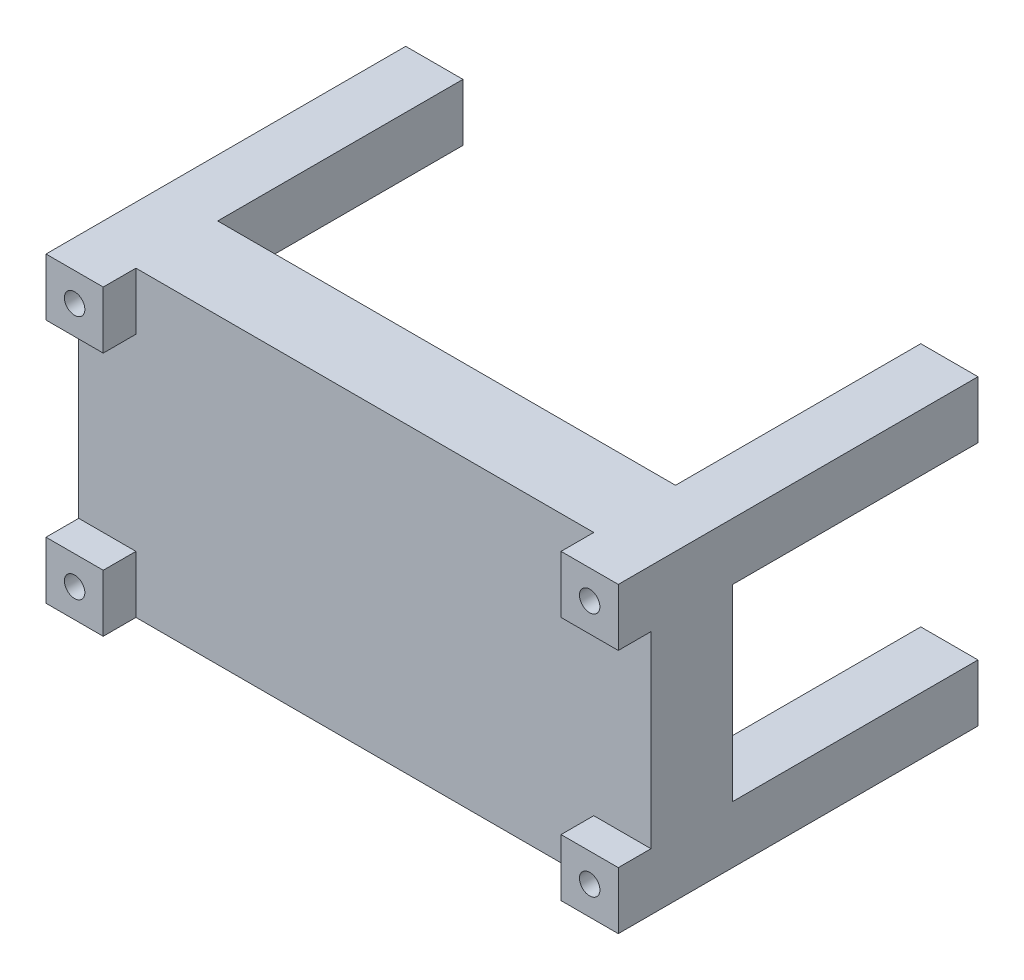
ISO-10303-21;
HEADER;
FILE_DESCRIPTION(('STEP AP214'),'2;1');
FILE_NAME('part.step','',(''),(''),'','','');
FILE_SCHEMA(('AUTOMOTIVE_DESIGN { 1 0 10303 214 1 1 1 1 }'));
ENDSEC;
DATA;
#1=APPLICATION_CONTEXT('core data for automotive mechanical design processes');
#2=APPLICATION_PROTOCOL_DEFINITION('international standard','automotive_design',2000,#1);
#3=PRODUCT_CONTEXT('',#1,'mechanical');
#4=PRODUCT('Part','Part','',(#3));
#5=PRODUCT_RELATED_PRODUCT_CATEGORY('part','',(#4));
#6=PRODUCT_DEFINITION_FORMATION('','',#4);
#7=PRODUCT_DEFINITION_CONTEXT('part definition',#1,'design');
#8=PRODUCT_DEFINITION('design','',#6,#7);
#9=PRODUCT_DEFINITION_SHAPE('','',#8);
#10=(LENGTH_UNIT() NAMED_UNIT(*) SI_UNIT(.MILLI.,.METRE.));
#11=(NAMED_UNIT(*) PLANE_ANGLE_UNIT() SI_UNIT($,.RADIAN.));
#12=(NAMED_UNIT(*) SI_UNIT($,.STERADIAN.) SOLID_ANGLE_UNIT());
#13=UNCERTAINTY_MEASURE_WITH_UNIT(LENGTH_MEASURE(1.E-05),#10,'distance_accuracy_value','');
#14=(GEOMETRIC_REPRESENTATION_CONTEXT(3) GLOBAL_UNCERTAINTY_ASSIGNED_CONTEXT((#13)) GLOBAL_UNIT_ASSIGNED_CONTEXT((#10,
#11,#12)) REPRESENTATION_CONTEXT('',''));
#15=CARTESIAN_POINT('',(0.,0.,0.));
#16=DIRECTION('',(0.,0.,1.));
#17=DIRECTION('',(1.,0.,0.));
#18=AXIS2_PLACEMENT_3D('',#15,#16,#17);
#19=CARTESIAN_POINT('',(0.,0.,10.));
#20=DIRECTION('',(1.,0.,0.));
#21=DIRECTION('',(0.,0.,-1.));
#22=AXIS2_PLACEMENT_3D('',#19,#20,#21);
#23=PLANE('',#22);
#24=DIRECTION('',(0.,-1.,0.));
#25=VECTOR('',#24,1.);
#26=CARTESIAN_POINT('',(0.,0.,0.));
#27=LINE('',#26,#25);
#28=CARTESIAN_POINT('',(0.,30.,0.));
#29=VERTEX_POINT('',#28);
#30=CARTESIAN_POINT('',(0.,7.,0.));
#31=VERTEX_POINT('',#30);
#32=EDGE_CURVE('E438',#29,#31,#27,.T.);
#33=ORIENTED_EDGE('',*,*,#32,.T.);
#34=DIRECTION('',(0.,0.,1.));
#35=VECTOR('',#34,1.);
#36=CARTESIAN_POINT('',(0.,7.,-30.));
#37=LINE('',#36,#35);
#38=CARTESIAN_POINT('',(0.,7.,-30.));
#39=VERTEX_POINT('',#38);
#40=EDGE_CURVE('E266',#39,#31,#37,.T.);
#41=ORIENTED_EDGE('',*,*,#40,.F.);
#42=DIRECTION('',(0.,-1.,0.));
#43=VECTOR('',#42,1.);
#44=CARTESIAN_POINT('',(0.,0.,-30.));
#45=LINE('',#44,#43);
#46=CARTESIAN_POINT('',(0.,0.,-30.));
#47=VERTEX_POINT('',#46);
#48=EDGE_CURVE('E225',#39,#47,#45,.T.);
#49=ORIENTED_EDGE('',*,*,#48,.T.);
#50=DIRECTION('',(0.,0.,-1.));
#51=VECTOR('',#50,1.);
#52=CARTESIAN_POINT('',(0.,0.,10.));
#53=LINE('',#52,#51);
#54=CARTESIAN_POINT('',(0.,0.,14.));
#55=VERTEX_POINT('',#54);
#56=EDGE_CURVE('E218',#55,#47,#53,.T.);
#57=ORIENTED_EDGE('',*,*,#56,.F.);
#58=DIRECTION('',(0.,-1.,0.));
#59=VECTOR('',#58,1.);
#60=CARTESIAN_POINT('',(0.,0.,14.));
#61=LINE('',#60,#59);
#62=CARTESIAN_POINT('',(0.,7.,14.));
#63=VERTEX_POINT('',#62);
#64=EDGE_CURVE('E223',#63,#55,#61,.T.);
#65=ORIENTED_EDGE('',*,*,#64,.F.);
#66=CARTESIAN_POINT('',(0.,7.,10.));
#67=VERTEX_POINT('',#66);
#68=EDGE_CURVE('E269',#67,#63,#37,.T.);
#69=ORIENTED_EDGE('',*,*,#68,.F.);
#70=DIRECTION('',(0.,-1.,0.));
#71=VECTOR('',#70,1.);
#72=CARTESIAN_POINT('',(0.,0.,10.));
#73=LINE('',#72,#71);
#74=CARTESIAN_POINT('',(0.,30.,10.));
#75=VERTEX_POINT('',#74);
#76=EDGE_CURVE('E53',#75,#67,#73,.T.);
#77=ORIENTED_EDGE('',*,*,#76,.F.);
#78=DIRECTION('',(0.,0.,1.));
#79=VECTOR('',#78,1.);
#80=CARTESIAN_POINT('',(0.,30.,-30.));
#81=LINE('',#80,#79);
#82=CARTESIAN_POINT('',(0.,30.,14.));
#83=VERTEX_POINT('',#82);
#84=EDGE_CURVE('E415',#75,#83,#81,.T.);
#85=ORIENTED_EDGE('',*,*,#84,.T.);
#86=DIRECTION('',(0.,-1.,0.));
#87=VECTOR('',#86,1.);
#88=CARTESIAN_POINT('',(0.,37.,14.));
#89=LINE('',#88,#87);
#90=CARTESIAN_POINT('',(0.,37.,14.));
#91=VERTEX_POINT('',#90);
#92=EDGE_CURVE('E388',#91,#83,#89,.T.);
#93=ORIENTED_EDGE('',*,*,#92,.F.);
#94=DIRECTION('',(0.,0.,-1.));
#95=VECTOR('',#94,1.);
#96=CARTESIAN_POINT('',(0.,37.,10.));
#97=LINE('',#96,#95);
#98=CARTESIAN_POINT('',(0.,37.,-30.));
#99=VERTEX_POINT('',#98);
#100=EDGE_CURVE('E447',#91,#99,#97,.T.);
#101=ORIENTED_EDGE('',*,*,#100,.T.);
#102=DIRECTION('',(0.,-1.,0.));
#103=VECTOR('',#102,1.);
#104=CARTESIAN_POINT('',(0.,37.,-30.));
#105=LINE('',#104,#103);
#106=CARTESIAN_POINT('',(0.,30.,-30.));
#107=VERTEX_POINT('',#106);
#108=EDGE_CURVE('E403',#99,#107,#105,.T.);
#109=ORIENTED_EDGE('',*,*,#108,.T.);
#110=EDGE_CURVE('E425',#107,#29,#81,.T.);
#111=ORIENTED_EDGE('',*,*,#110,.T.);
#112=EDGE_LOOP('',(#33,#41,#49,#57,#65,#69,#77,#85,#93,#101,#109,#111));
#113=FACE_BOUND('',#112,.T.);
#114=ADVANCED_FACE('F33',(#113),#23,.F.);
#115=CARTESIAN_POINT('',(0.,0.,10.));
#116=DIRECTION('',(0.,1.,0.));
#117=DIRECTION('',(0.,0.,1.));
#118=AXIS2_PLACEMENT_3D('',#115,#116,#117);
#119=PLANE('',#118);
#120=DIRECTION('',(1.,0.,0.));
#121=VECTOR('',#120,1.);
#122=CARTESIAN_POINT('',(0.,0.,10.));
#123=LINE('',#122,#121);
#124=CARTESIAN_POINT('',(7.,0.,10.));
#125=VERTEX_POINT('',#124);
#126=CARTESIAN_POINT('',(63.,0.,10.));
#127=VERTEX_POINT('',#126);
#128=EDGE_CURVE('E440',#125,#127,#123,.T.);
#129=ORIENTED_EDGE('',*,*,#128,.F.);
#130=DIRECTION('',(0.,0.,1.));
#131=VECTOR('',#130,1.);
#132=CARTESIAN_POINT('',(7.,0.,-30.));
#133=LINE('',#132,#131);
#134=CARTESIAN_POINT('',(7.,0.,14.));
#135=VERTEX_POINT('',#134);
#136=EDGE_CURVE('E236',#125,#135,#133,.T.);
#137=ORIENTED_EDGE('',*,*,#136,.T.);
#138=DIRECTION('',(1.,0.,0.));
#139=VECTOR('',#138,1.);
#140=CARTESIAN_POINT('',(0.,0.,14.));
#141=LINE('',#140,#139);
#142=EDGE_CURVE('E233',#55,#135,#141,.T.);
#143=ORIENTED_EDGE('',*,*,#142,.F.);
#144=ORIENTED_EDGE('',*,*,#56,.T.);
#145=DIRECTION('',(1.,0.,0.));
#146=VECTOR('',#145,1.);
#147=CARTESIAN_POINT('',(0.,0.,-30.));
#148=LINE('',#147,#146);
#149=CARTESIAN_POINT('',(7.,0.,-30.));
#150=VERTEX_POINT('',#149);
#151=EDGE_CURVE('E258',#47,#150,#148,.T.);
#152=ORIENTED_EDGE('',*,*,#151,.T.);
#153=CARTESIAN_POINT('',(7.,0.,0.));
#154=VERTEX_POINT('',#153);
#155=EDGE_CURVE('E274',#150,#154,#133,.T.);
#156=ORIENTED_EDGE('',*,*,#155,.T.);
#157=DIRECTION('',(1.,0.,0.));
#158=VECTOR('',#157,1.);
#159=CARTESIAN_POINT('',(0.,0.,0.));
#160=LINE('',#159,#158);
#161=CARTESIAN_POINT('',(63.,0.,0.));
#162=VERTEX_POINT('',#161);
#163=EDGE_CURVE('E449',#154,#162,#160,.T.);
#164=ORIENTED_EDGE('',*,*,#163,.T.);
#165=DIRECTION('',(0.,0.,1.));
#166=VECTOR('',#165,1.);
#167=CARTESIAN_POINT('',(63.,0.,-30.));
#168=LINE('',#167,#166);
#169=CARTESIAN_POINT('',(63.,0.,-30.));
#170=VERTEX_POINT('',#169);
#171=EDGE_CURVE('E310',#170,#162,#168,.T.);
#172=ORIENTED_EDGE('',*,*,#171,.F.);
#173=DIRECTION('',(1.,0.,0.));
#174=VECTOR('',#173,1.);
#175=CARTESIAN_POINT('',(70.,0.,-30.));
#176=LINE('',#175,#174);
#177=CARTESIAN_POINT('',(70.,0.,-30.));
#178=VERTEX_POINT('',#177);
#179=EDGE_CURVE('E306',#170,#178,#176,.T.);
#180=ORIENTED_EDGE('',*,*,#179,.T.);
#181=DIRECTION('',(0.,0.,-1.));
#182=VECTOR('',#181,1.);
#183=CARTESIAN_POINT('',(70.,0.,10.));
#184=LINE('',#183,#182);
#185=CARTESIAN_POINT('',(70.,0.,14.));
#186=VERTEX_POINT('',#185);
#187=EDGE_CURVE('E230',#186,#178,#184,.T.);
#188=ORIENTED_EDGE('',*,*,#187,.F.);
#189=DIRECTION('',(1.,0.,0.));
#190=VECTOR('',#189,1.);
#191=CARTESIAN_POINT('',(70.,0.,14.));
#192=LINE('',#191,#190);
#193=CARTESIAN_POINT('',(63.,0.,14.));
#194=VERTEX_POINT('',#193);
#195=EDGE_CURVE('E291',#194,#186,#192,.T.);
#196=ORIENTED_EDGE('',*,*,#195,.F.);
#197=EDGE_CURVE('E314',#127,#194,#168,.T.);
#198=ORIENTED_EDGE('',*,*,#197,.F.);
#199=EDGE_LOOP('',(#129,#137,#143,#144,#152,#156,#164,#172,#180,#188,#196,#198));
#200=FACE_BOUND('',#199,.T.);
#201=ADVANCED_FACE('F234',(#200),#119,.F.);
#202=CARTESIAN_POINT('',(70.,0.,10.));
#203=DIRECTION('',(-1.,0.,0.));
#204=DIRECTION('',(0.,0.,1.));
#205=AXIS2_PLACEMENT_3D('',#202,#203,#204);
#206=PLANE('',#205);
#207=DIRECTION('',(0.,1.,0.));
#208=VECTOR('',#207,1.);
#209=CARTESIAN_POINT('',(70.,0.,10.));
#210=LINE('',#209,#208);
#211=CARTESIAN_POINT('',(70.,7.,10.));
#212=VERTEX_POINT('',#211);
#213=CARTESIAN_POINT('',(70.,30.,10.));
#214=VERTEX_POINT('',#213);
#215=EDGE_CURVE('E443',#212,#214,#210,.T.);
#216=ORIENTED_EDGE('',*,*,#215,.F.);
#217=DIRECTION('',(0.,0.,1.));
#218=VECTOR('',#217,1.);
#219=CARTESIAN_POINT('',(70.,7.,-30.));
#220=LINE('',#219,#218);
#221=CARTESIAN_POINT('',(70.,7.,14.));
#222=VERTEX_POINT('',#221);
#223=EDGE_CURVE('E309',#212,#222,#220,.T.);
#224=ORIENTED_EDGE('',*,*,#223,.T.);
#225=DIRECTION('',(0.,1.,0.));
#226=VECTOR('',#225,1.);
#227=CARTESIAN_POINT('',(70.,0.,14.));
#228=LINE('',#227,#226);
#229=EDGE_CURVE('E282',#186,#222,#228,.T.);
#230=ORIENTED_EDGE('',*,*,#229,.F.);
#231=ORIENTED_EDGE('',*,*,#187,.T.);
#232=DIRECTION('',(0.,1.,0.));
#233=VECTOR('',#232,1.);
#234=CARTESIAN_POINT('',(70.,0.,-30.));
#235=LINE('',#234,#233);
#236=CARTESIAN_POINT('',(70.,7.,-30.));
#237=VERTEX_POINT('',#236);
#238=EDGE_CURVE('E297',#178,#237,#235,.T.);
#239=ORIENTED_EDGE('',*,*,#238,.T.);
#240=CARTESIAN_POINT('',(70.,7.,0.));
#241=VERTEX_POINT('',#240);
#242=EDGE_CURVE('E319',#237,#241,#220,.T.);
#243=ORIENTED_EDGE('',*,*,#242,.T.);
#244=DIRECTION('',(0.,1.,0.));
#245=VECTOR('',#244,1.);
#246=CARTESIAN_POINT('',(70.,0.,0.));
#247=LINE('',#246,#245);
#248=CARTESIAN_POINT('',(70.,30.,0.));
#249=VERTEX_POINT('',#248);
#250=EDGE_CURVE('E451',#241,#249,#247,.T.);
#251=ORIENTED_EDGE('',*,*,#250,.T.);
#252=DIRECTION('',(0.,0.,1.));
#253=VECTOR('',#252,1.);
#254=CARTESIAN_POINT('',(70.,30.,-30.));
#255=LINE('',#254,#253);
#256=CARTESIAN_POINT('',(70.,30.,-30.));
#257=VERTEX_POINT('',#256);
#258=EDGE_CURVE('E364',#257,#249,#255,.T.);
#259=ORIENTED_EDGE('',*,*,#258,.F.);
#260=DIRECTION('',(0.,1.,0.));
#261=VECTOR('',#260,1.);
#262=CARTESIAN_POINT('',(70.,37.,-30.));
#263=LINE('',#262,#261);
#264=CARTESIAN_POINT('',(70.,37.,-30.));
#265=VERTEX_POINT('',#264);
#266=EDGE_CURVE('E351',#257,#265,#263,.T.);
#267=ORIENTED_EDGE('',*,*,#266,.T.);
#268=DIRECTION('',(0.,0.,-1.));
#269=VECTOR('',#268,1.);
#270=CARTESIAN_POINT('',(70.,37.,10.));
#271=LINE('',#270,#269);
#272=CARTESIAN_POINT('',(70.,37.,14.));
#273=VERTEX_POINT('',#272);
#274=EDGE_CURVE('E455',#273,#265,#271,.T.);
#275=ORIENTED_EDGE('',*,*,#274,.F.);
#276=DIRECTION('',(0.,1.,0.));
#277=VECTOR('',#276,1.);
#278=CARTESIAN_POINT('',(70.,37.,14.));
#279=LINE('',#278,#277);
#280=CARTESIAN_POINT('',(70.,30.,14.));
#281=VERTEX_POINT('',#280);
#282=EDGE_CURVE('E336',#281,#273,#279,.T.);
#283=ORIENTED_EDGE('',*,*,#282,.F.);
#284=EDGE_CURVE('E368',#214,#281,#255,.T.);
#285=ORIENTED_EDGE('',*,*,#284,.F.);
#286=EDGE_LOOP('',(#216,#224,#230,#231,#239,#243,#251,#259,#267,#275,#283,#285));
#287=FACE_BOUND('',#286,.T.);
#288=ADVANCED_FACE('F508',(#287),#206,.F.);
#289=CARTESIAN_POINT('',(0.,37.,10.));
#290=DIRECTION('',(0.,-1.,0.));
#291=DIRECTION('',(0.,0.,-1.));
#292=AXIS2_PLACEMENT_3D('',#289,#290,#291);
#293=PLANE('',#292);
#294=DIRECTION('',(-1.,0.,0.));
#295=VECTOR('',#294,1.);
#296=CARTESIAN_POINT('',(0.,37.,10.));
#297=LINE('',#296,#295);
#298=CARTESIAN_POINT('',(63.,37.,10.));
#299=VERTEX_POINT('',#298);
#300=CARTESIAN_POINT('',(7.,37.,10.));
#301=VERTEX_POINT('',#300);
#302=EDGE_CURVE('E445',#299,#301,#297,.T.);
#303=ORIENTED_EDGE('',*,*,#302,.F.);
#304=DIRECTION('',(0.,0.,1.));
#305=VECTOR('',#304,1.);
#306=CARTESIAN_POINT('',(63.,37.,-30.));
#307=LINE('',#306,#305);
#308=CARTESIAN_POINT('',(63.,37.,14.));
#309=VERTEX_POINT('',#308);
#310=EDGE_CURVE('E363',#299,#309,#307,.T.);
#311=ORIENTED_EDGE('',*,*,#310,.T.);
#312=DIRECTION('',(-1.,0.,0.));
#313=VECTOR('',#312,1.);
#314=CARTESIAN_POINT('',(70.,37.,14.));
#315=LINE('',#314,#313);
#316=EDGE_CURVE('E339',#273,#309,#315,.T.);
#317=ORIENTED_EDGE('',*,*,#316,.F.);
#318=ORIENTED_EDGE('',*,*,#274,.T.);
#319=DIRECTION('',(-1.,0.,0.));
#320=VECTOR('',#319,1.);
#321=CARTESIAN_POINT('',(70.,37.,-30.));
#322=LINE('',#321,#320);
#323=CARTESIAN_POINT('',(63.,37.,-30.));
#324=VERTEX_POINT('',#323);
#325=EDGE_CURVE('E354',#265,#324,#322,.T.);
#326=ORIENTED_EDGE('',*,*,#325,.T.);
#327=CARTESIAN_POINT('',(63.,37.,0.));
#328=VERTEX_POINT('',#327);
#329=EDGE_CURVE('E373',#324,#328,#307,.T.);
#330=ORIENTED_EDGE('',*,*,#329,.T.);
#331=DIRECTION('',(-1.,0.,0.));
#332=VECTOR('',#331,1.);
#333=CARTESIAN_POINT('',(0.,37.,0.));
#334=LINE('',#333,#332);
#335=CARTESIAN_POINT('',(7.,37.,0.));
#336=VERTEX_POINT('',#335);
#337=EDGE_CURVE('E441',#328,#336,#334,.T.);
#338=ORIENTED_EDGE('',*,*,#337,.T.);
#339=DIRECTION('',(0.,0.,1.));
#340=VECTOR('',#339,1.);
#341=CARTESIAN_POINT('',(7.,37.,-30.));
#342=LINE('',#341,#340);
#343=CARTESIAN_POINT('',(7.,37.,-30.));
#344=VERTEX_POINT('',#343);
#345=EDGE_CURVE('E416',#344,#336,#342,.T.);
#346=ORIENTED_EDGE('',*,*,#345,.F.);
#347=DIRECTION('',(-1.,0.,0.));
#348=VECTOR('',#347,1.);
#349=CARTESIAN_POINT('',(0.,37.,-30.));
#350=LINE('',#349,#348);
#351=EDGE_CURVE('E412',#344,#99,#350,.T.);
#352=ORIENTED_EDGE('',*,*,#351,.T.);
#353=ORIENTED_EDGE('',*,*,#100,.F.);
#354=DIRECTION('',(-1.,0.,0.));
#355=VECTOR('',#354,1.);
#356=CARTESIAN_POINT('',(0.,37.,14.));
#357=LINE('',#356,#355);
#358=CARTESIAN_POINT('',(7.,37.,14.));
#359=VERTEX_POINT('',#358);
#360=EDGE_CURVE('E397',#359,#91,#357,.T.);
#361=ORIENTED_EDGE('',*,*,#360,.F.);
#362=EDGE_CURVE('E420',#301,#359,#342,.T.);
#363=ORIENTED_EDGE('',*,*,#362,.F.);
#364=EDGE_LOOP('',(#303,#311,#317,#318,#326,#330,#338,#346,#352,#353,#361,#363));
#365=FACE_BOUND('',#364,.T.);
#366=ADVANCED_FACE('F512',(#365),#293,.F.);
#367=CARTESIAN_POINT('',(0.,0.,10.));
#368=DIRECTION('',(0.,0.,-1.));
#369=DIRECTION('',(-1.,0.,0.));
#370=AXIS2_PLACEMENT_3D('',#367,#368,#369);
#371=PLANE('',#370);
#372=ORIENTED_EDGE('',*,*,#76,.T.);
#373=DIRECTION('',(1.,0.,0.));
#374=VECTOR('',#373,1.);
#375=CARTESIAN_POINT('',(0.,7.,10.));
#376=LINE('',#375,#374);
#377=CARTESIAN_POINT('',(7.,7.,10.));
#378=VERTEX_POINT('',#377);
#379=EDGE_CURVE('E48',#67,#378,#376,.T.);
#380=ORIENTED_EDGE('',*,*,#379,.T.);
#381=DIRECTION('',(0.,-1.,0.));
#382=VECTOR('',#381,1.);
#383=CARTESIAN_POINT('',(7.,0.,10.));
#384=LINE('',#383,#382);
#385=EDGE_CURVE('E276',#378,#125,#384,.T.);
#386=ORIENTED_EDGE('',*,*,#385,.T.);
#387=ORIENTED_EDGE('',*,*,#128,.T.);
#388=DIRECTION('',(0.,1.,0.));
#389=VECTOR('',#388,1.);
#390=CARTESIAN_POINT('',(63.,0.,10.));
#391=LINE('',#390,#389);
#392=CARTESIAN_POINT('',(63.,7.,10.));
#393=VERTEX_POINT('',#392);
#394=EDGE_CURVE('E330',#127,#393,#391,.T.);
#395=ORIENTED_EDGE('',*,*,#394,.T.);
#396=DIRECTION('',(1.,0.,0.));
#397=VECTOR('',#396,1.);
#398=CARTESIAN_POINT('',(0.,6.99999999999999,10.));
#399=LINE('',#398,#397);
#400=EDGE_CURVE('E327',#393,#212,#399,.T.);
#401=ORIENTED_EDGE('',*,*,#400,.T.);
#402=ORIENTED_EDGE('',*,*,#215,.T.);
#403=DIRECTION('',(-1.,0.,0.));
#404=VECTOR('',#403,1.);
#405=CARTESIAN_POINT('',(0.,30.,10.));
#406=LINE('',#405,#404);
#407=CARTESIAN_POINT('',(63.,30.,10.));
#408=VERTEX_POINT('',#407);
#409=EDGE_CURVE('E383',#214,#408,#406,.T.);
#410=ORIENTED_EDGE('',*,*,#409,.T.);
#411=DIRECTION('',(0.,1.,0.));
#412=VECTOR('',#411,1.);
#413=CARTESIAN_POINT('',(63.,0.,10.));
#414=LINE('',#413,#412);
#415=EDGE_CURVE('E380',#408,#299,#414,.T.);
#416=ORIENTED_EDGE('',*,*,#415,.T.);
#417=ORIENTED_EDGE('',*,*,#302,.T.);
#418=DIRECTION('',(0.,-1.,0.));
#419=VECTOR('',#418,1.);
#420=CARTESIAN_POINT('',(7.,0.,10.));
#421=LINE('',#420,#419);
#422=CARTESIAN_POINT('',(7.,30.,10.));
#423=VERTEX_POINT('',#422);
#424=EDGE_CURVE('E435',#301,#423,#421,.T.);
#425=ORIENTED_EDGE('',*,*,#424,.T.);
#426=DIRECTION('',(-1.,0.,0.));
#427=VECTOR('',#426,1.);
#428=CARTESIAN_POINT('',(0.,30.,10.));
#429=LINE('',#428,#427);
#430=EDGE_CURVE('E433',#423,#75,#429,.T.);
#431=ORIENTED_EDGE('',*,*,#430,.T.);
#432=EDGE_LOOP('',(#372,#380,#386,#387,#395,#401,#402,#410,#416,#417,#425,#431));
#433=FACE_BOUND('',#432,.T.);
#434=ADVANCED_FACE('F518',(#433),#371,.F.);
#435=CARTESIAN_POINT('',(0.,0.,0.));
#436=DIRECTION('',(0.,0.,-1.));
#437=DIRECTION('',(-1.,0.,0.));
#438=AXIS2_PLACEMENT_3D('',#435,#436,#437);
#439=PLANE('',#438);
#440=DIRECTION('',(1.,0.,0.));
#441=VECTOR('',#440,1.);
#442=CARTESIAN_POINT('',(0.,7.,0.));
#443=LINE('',#442,#441);
#444=CARTESIAN_POINT('',(7.,7.,0.));
#445=VERTEX_POINT('',#444);
#446=EDGE_CURVE('E36',#31,#445,#443,.T.);
#447=ORIENTED_EDGE('',*,*,#446,.F.);
#448=ORIENTED_EDGE('',*,*,#32,.F.);
#449=DIRECTION('',(-1.,0.,0.));
#450=VECTOR('',#449,1.);
#451=CARTESIAN_POINT('',(0.,30.,0.));
#452=LINE('',#451,#450);
#453=CARTESIAN_POINT('',(7.,30.,0.));
#454=VERTEX_POINT('',#453);
#455=EDGE_CURVE('E229',#454,#29,#452,.T.);
#456=ORIENTED_EDGE('',*,*,#455,.F.);
#457=DIRECTION('',(0.,-1.,0.));
#458=VECTOR('',#457,1.);
#459=CARTESIAN_POINT('',(7.,0.,0.));
#460=LINE('',#459,#458);
#461=EDGE_CURVE('E432',#336,#454,#460,.T.);
#462=ORIENTED_EDGE('',*,*,#461,.F.);
#463=ORIENTED_EDGE('',*,*,#337,.F.);
#464=DIRECTION('',(0.,1.,0.));
#465=VECTOR('',#464,1.);
#466=CARTESIAN_POINT('',(63.,0.,0.));
#467=LINE('',#466,#465);
#468=CARTESIAN_POINT('',(63.,30.,0.));
#469=VERTEX_POINT('',#468);
#470=EDGE_CURVE('E431',#469,#328,#467,.T.);
#471=ORIENTED_EDGE('',*,*,#470,.F.);
#472=DIRECTION('',(-1.,0.,0.));
#473=VECTOR('',#472,1.);
#474=CARTESIAN_POINT('',(0.,30.,0.));
#475=LINE('',#474,#473);
#476=EDGE_CURVE('E379',#249,#469,#475,.T.);
#477=ORIENTED_EDGE('',*,*,#476,.F.);
#478=ORIENTED_EDGE('',*,*,#250,.F.);
#479=DIRECTION('',(1.,0.,0.));
#480=VECTOR('',#479,1.);
#481=CARTESIAN_POINT('',(0.,6.99999999999999,0.));
#482=LINE('',#481,#480);
#483=CARTESIAN_POINT('',(63.,7.,0.));
#484=VERTEX_POINT('',#483);
#485=EDGE_CURVE('E378',#484,#241,#482,.T.);
#486=ORIENTED_EDGE('',*,*,#485,.F.);
#487=DIRECTION('',(0.,1.,0.));
#488=VECTOR('',#487,1.);
#489=CARTESIAN_POINT('',(63.,0.,0.));
#490=LINE('',#489,#488);
#491=EDGE_CURVE('E326',#162,#484,#490,.T.);
#492=ORIENTED_EDGE('',*,*,#491,.F.);
#493=ORIENTED_EDGE('',*,*,#163,.F.);
#494=DIRECTION('',(0.,-1.,0.));
#495=VECTOR('',#494,1.);
#496=CARTESIAN_POINT('',(7.,0.,0.));
#497=LINE('',#496,#495);
#498=EDGE_CURVE('E325',#445,#154,#497,.T.);
#499=ORIENTED_EDGE('',*,*,#498,.F.);
#500=EDGE_LOOP('',(#447,#448,#456,#462,#463,#471,#477,#478,#486,#492,#493,#499));
#501=FACE_BOUND('',#500,.T.);
#502=ADVANCED_FACE('F487',(#501),#439,.T.);
#503=CARTESIAN_POINT('',(0.,30.,-30.));
#504=DIRECTION('',(0.,-1.,0.));
#505=DIRECTION('',(0.,0.,-1.));
#506=AXIS2_PLACEMENT_3D('',#503,#504,#505);
#507=PLANE('',#506);
#508=DIRECTION('',(0.,0.,1.));
#509=VECTOR('',#508,1.);
#510=CARTESIAN_POINT('',(7.,30.,-30.));
#511=LINE('',#510,#509);
#512=CARTESIAN_POINT('',(7.,30.,-30.));
#513=VERTEX_POINT('',#512);
#514=EDGE_CURVE('E421',#513,#454,#511,.T.);
#515=ORIENTED_EDGE('',*,*,#514,.T.);
#516=ORIENTED_EDGE('',*,*,#455,.T.);
#517=ORIENTED_EDGE('',*,*,#110,.F.);
#518=DIRECTION('',(1.,0.,0.));
#519=VECTOR('',#518,1.);
#520=CARTESIAN_POINT('',(0.,30.,-30.));
#521=LINE('',#520,#519);
#522=EDGE_CURVE('E406',#107,#513,#521,.T.);
#523=ORIENTED_EDGE('',*,*,#522,.T.);
#524=EDGE_LOOP('',(#515,#516,#517,#523));
#525=FACE_BOUND('',#524,.T.);
#526=ADVANCED_FACE('F522',(#525),#507,.T.);
#527=CARTESIAN_POINT('',(7.,37.,-30.));
#528=DIRECTION('',(1.,0.,0.));
#529=DIRECTION('',(0.,1.,0.));
#530=AXIS2_PLACEMENT_3D('',#527,#528,#529);
#531=PLANE('',#530);
#532=ORIENTED_EDGE('',*,*,#345,.T.);
#533=ORIENTED_EDGE('',*,*,#461,.T.);
#534=ORIENTED_EDGE('',*,*,#514,.F.);
#535=DIRECTION('',(0.,1.,0.));
#536=VECTOR('',#535,1.);
#537=CARTESIAN_POINT('',(7.,37.,-30.));
#538=LINE('',#537,#536);
#539=EDGE_CURVE('E409',#513,#344,#538,.T.);
#540=ORIENTED_EDGE('',*,*,#539,.T.);
#541=EDGE_LOOP('',(#532,#533,#534,#540));
#542=FACE_BOUND('',#541,.T.);
#543=ADVANCED_FACE('F531',(#542),#531,.T.);
#544=CARTESIAN_POINT('',(0.,0.,-30.));
#545=DIRECTION('',(0.,0.,1.));
#546=DIRECTION('',(1.,0.,0.));
#547=AXIS2_PLACEMENT_3D('',#544,#545,#546);
#548=PLANE('',#547);
#549=CARTESIAN_POINT('',(3.5,33.5,-30.));
#550=DIRECTION('',(0.,0.,1.));
#551=DIRECTION('',(1.,0.,0.));
#552=AXIS2_PLACEMENT_3D('',#549,#550,#551);
#553=CIRCLE('',#552,1.25);
#554=CARTESIAN_POINT('',(4.75,33.5,-30.));
#555=VERTEX_POINT('',#554);
#556=EDGE_CURVE('E400',#555,#555,#553,.T.);
#557=ORIENTED_EDGE('',*,*,#556,.T.);
#558=EDGE_LOOP('',(#557));
#559=FACE_BOUND('',#558,.T.);
#560=ORIENTED_EDGE('',*,*,#108,.F.);
#561=ORIENTED_EDGE('',*,*,#351,.F.);
#562=ORIENTED_EDGE('',*,*,#539,.F.);
#563=ORIENTED_EDGE('',*,*,#522,.F.);
#564=EDGE_LOOP('',(#560,#561,#562,#563));
#565=FACE_BOUND('',#564,.T.);
#566=ADVANCED_FACE('F536',(#559,#565),#548,.F.);
#567=CARTESIAN_POINT('',(3.5,33.5,-30.));
#568=DIRECTION('',(0.,0.,1.));
#569=DIRECTION('',(1.,0.,0.));
#570=AXIS2_PLACEMENT_3D('',#567,#568,#569);
#571=CYLINDRICAL_SURFACE('',#570,1.25);
#572=CARTESIAN_POINT('',(3.5,33.5,0.));
#573=DIRECTION('',(0.,0.,-1.));
#574=DIRECTION('',(-1.,0.,0.));
#575=AXIS2_PLACEMENT_3D('',#572,#573,#574);
#576=CIRCLE('',#575,1.25);
#577=CARTESIAN_POINT('',(2.25,33.5,0.));
#578=VERTEX_POINT('',#577);
#579=EDGE_CURVE('E419',#578,#578,#576,.T.);
#580=ORIENTED_EDGE('',*,*,#579,.F.);
#581=EDGE_LOOP('',(#580));
#582=FACE_BOUND('',#581,.T.);
#583=ORIENTED_EDGE('',*,*,#556,.F.);
#584=EDGE_LOOP('',(#583));
#585=FACE_BOUND('',#584,.T.);
#586=ADVANCED_FACE('F541',(#582,#585),#571,.F.);
#587=ORIENTED_EDGE('',*,*,#424,.F.);
#588=ORIENTED_EDGE('',*,*,#362,.T.);
#589=DIRECTION('',(0.,1.,0.));
#590=VECTOR('',#589,1.);
#591=CARTESIAN_POINT('',(7.,37.,14.));
#592=LINE('',#591,#590);
#593=CARTESIAN_POINT('',(7.,30.,14.));
#594=VERTEX_POINT('',#593);
#595=EDGE_CURVE('E394',#594,#359,#592,.T.);
#596=ORIENTED_EDGE('',*,*,#595,.F.);
#597=EDGE_CURVE('E424',#423,#594,#511,.T.);
#598=ORIENTED_EDGE('',*,*,#597,.F.);
#599=EDGE_LOOP('',(#587,#588,#596,#598));
#600=FACE_BOUND('',#599,.T.);
#601=ADVANCED_FACE('F538',(#600),#531,.T.);
#602=ORIENTED_EDGE('',*,*,#430,.F.);
#603=ORIENTED_EDGE('',*,*,#597,.T.);
#604=DIRECTION('',(1.,0.,0.));
#605=VECTOR('',#604,1.);
#606=CARTESIAN_POINT('',(0.,30.,14.));
#607=LINE('',#606,#605);
#608=EDGE_CURVE('E391',#83,#594,#607,.T.);
#609=ORIENTED_EDGE('',*,*,#608,.F.);
#610=ORIENTED_EDGE('',*,*,#84,.F.);
#611=EDGE_LOOP('',(#602,#603,#609,#610));
#612=FACE_BOUND('',#611,.T.);
#613=ADVANCED_FACE('F533',(#612),#507,.T.);
#614=CARTESIAN_POINT('',(3.5,33.5,14.));
#615=DIRECTION('',(0.,0.,1.));
#616=DIRECTION('',(1.,0.,0.));
#617=AXIS2_PLACEMENT_3D('',#614,#615,#616);
#618=CIRCLE('',#617,1.25);
#619=CARTESIAN_POINT('',(4.75,33.5,14.));
#620=VERTEX_POINT('',#619);
#621=EDGE_CURVE('E385',#620,#620,#618,.T.);
#622=ORIENTED_EDGE('',*,*,#621,.T.);
#623=EDGE_LOOP('',(#622));
#624=FACE_BOUND('',#623,.T.);
#625=CARTESIAN_POINT('',(3.5,33.5,10.));
#626=DIRECTION('',(0.,0.,-1.));
#627=DIRECTION('',(-1.,0.,0.));
#628=AXIS2_PLACEMENT_3D('',#625,#626,#627);
#629=CIRCLE('',#628,1.25);
#630=CARTESIAN_POINT('',(2.25,33.5,10.));
#631=VERTEX_POINT('',#630);
#632=EDGE_CURVE('E428',#631,#631,#629,.T.);
#633=ORIENTED_EDGE('',*,*,#632,.T.);
#634=EDGE_LOOP('',(#633));
#635=FACE_BOUND('',#634,.T.);
#636=ADVANCED_FACE('F546',(#624,#635),#571,.F.);
#637=CARTESIAN_POINT('',(0.,0.,14.));
#638=DIRECTION('',(0.,0.,1.));
#639=DIRECTION('',(1.,0.,0.));
#640=AXIS2_PLACEMENT_3D('',#637,#638,#639);
#641=PLANE('',#640);
#642=ORIENTED_EDGE('',*,*,#92,.T.);
#643=ORIENTED_EDGE('',*,*,#608,.T.);
#644=ORIENTED_EDGE('',*,*,#595,.T.);
#645=ORIENTED_EDGE('',*,*,#360,.T.);
#646=EDGE_LOOP('',(#642,#643,#644,#645));
#647=FACE_BOUND('',#646,.T.);
#648=ORIENTED_EDGE('',*,*,#621,.F.);
#649=EDGE_LOOP('',(#648));
#650=FACE_BOUND('',#649,.T.);
#651=ADVANCED_FACE('F547',(#647,#650),#641,.T.);
#652=ORIENTED_EDGE('',*,*,#632,.F.);
#653=EDGE_LOOP('',(#652));
#654=FACE_BOUND('',#653,.T.);
#655=ADVANCED_FACE('F528',(#654),#371,.F.);
#656=ORIENTED_EDGE('',*,*,#579,.T.);
#657=EDGE_LOOP('',(#656));
#658=FACE_BOUND('',#657,.T.);
#659=ADVANCED_FACE('F524',(#658),#439,.T.);
#660=CARTESIAN_POINT('',(63.,37.,-30.));
#661=DIRECTION('',(-1.,0.,0.));
#662=DIRECTION('',(0.,0.,1.));
#663=AXIS2_PLACEMENT_3D('',#660,#661,#662);
#664=PLANE('',#663);
#665=DIRECTION('',(0.,0.,1.));
#666=VECTOR('',#665,1.);
#667=CARTESIAN_POINT('',(63.,30.,-30.));
#668=LINE('',#667,#666);
#669=CARTESIAN_POINT('',(63.,30.,-30.));
#670=VERTEX_POINT('',#669);
#671=EDGE_CURVE('E369',#670,#469,#668,.T.);
#672=ORIENTED_EDGE('',*,*,#671,.T.);
#673=ORIENTED_EDGE('',*,*,#470,.T.);
#674=ORIENTED_EDGE('',*,*,#329,.F.);
#675=DIRECTION('',(0.,-1.,0.));
#676=VECTOR('',#675,1.);
#677=CARTESIAN_POINT('',(63.,37.,-30.));
#678=LINE('',#677,#676);
#679=EDGE_CURVE('E357',#324,#670,#678,.T.);
#680=ORIENTED_EDGE('',*,*,#679,.T.);
#681=EDGE_LOOP('',(#672,#673,#674,#680));
#682=FACE_BOUND('',#681,.T.);
#683=ADVANCED_FACE('F551',(#682),#664,.T.);
#684=CARTESIAN_POINT('',(70.,30.,-30.));
#685=DIRECTION('',(0.,-1.,0.));
#686=DIRECTION('',(0.,0.,-1.));
#687=AXIS2_PLACEMENT_3D('',#684,#685,#686);
#688=PLANE('',#687);
#689=ORIENTED_EDGE('',*,*,#258,.T.);
#690=ORIENTED_EDGE('',*,*,#476,.T.);
#691=ORIENTED_EDGE('',*,*,#671,.F.);
#692=DIRECTION('',(1.,0.,0.));
#693=VECTOR('',#692,1.);
#694=CARTESIAN_POINT('',(70.,30.,-30.));
#695=LINE('',#694,#693);
#696=EDGE_CURVE('E360',#670,#257,#695,.T.);
#697=ORIENTED_EDGE('',*,*,#696,.T.);
#698=EDGE_LOOP('',(#689,#690,#691,#697));
#699=FACE_BOUND('',#698,.T.);
#700=ADVANCED_FACE('F554',(#699),#688,.T.);
#701=CARTESIAN_POINT('',(0.,0.,-30.));
#702=DIRECTION('',(0.,0.,-1.));
#703=DIRECTION('',(-1.,0.,0.));
#704=AXIS2_PLACEMENT_3D('',#701,#702,#703);
#705=PLANE('',#704);
#706=CARTESIAN_POINT('',(66.5,33.5,-30.));
#707=DIRECTION('',(0.,0.,1.));
#708=DIRECTION('',(1.,0.,0.));
#709=AXIS2_PLACEMENT_3D('',#706,#707,#708);
#710=CIRCLE('',#709,1.25);
#711=CARTESIAN_POINT('',(67.75,33.5,-30.));
#712=VERTEX_POINT('',#711);
#713=EDGE_CURVE('E348',#712,#712,#710,.T.);
#714=ORIENTED_EDGE('',*,*,#713,.T.);
#715=EDGE_LOOP('',(#714));
#716=FACE_BOUND('',#715,.T.);
#717=ORIENTED_EDGE('',*,*,#266,.F.);
#718=ORIENTED_EDGE('',*,*,#696,.F.);
#719=ORIENTED_EDGE('',*,*,#679,.F.);
#720=ORIENTED_EDGE('',*,*,#325,.F.);
#721=EDGE_LOOP('',(#717,#718,#719,#720));
#722=FACE_BOUND('',#721,.T.);
#723=ADVANCED_FACE('F559',(#716,#722),#705,.T.);
#724=CARTESIAN_POINT('',(66.5,33.5,-30.));
#725=DIRECTION('',(0.,0.,1.));
#726=DIRECTION('',(1.,0.,0.));
#727=AXIS2_PLACEMENT_3D('',#724,#725,#726);
#728=CYLINDRICAL_SURFACE('',#727,1.25);
#729=CARTESIAN_POINT('',(66.5,33.5,0.));
#730=DIRECTION('',(0.,0.,-1.));
#731=DIRECTION('',(-1.,0.,0.));
#732=AXIS2_PLACEMENT_3D('',#729,#730,#731);
#733=CIRCLE('',#732,1.25);
#734=CARTESIAN_POINT('',(65.25,33.5,0.));
#735=VERTEX_POINT('',#734);
#736=EDGE_CURVE('E367',#735,#735,#733,.T.);
#737=ORIENTED_EDGE('',*,*,#736,.F.);
#738=EDGE_LOOP('',(#737));
#739=FACE_BOUND('',#738,.T.);
#740=ORIENTED_EDGE('',*,*,#713,.F.);
#741=EDGE_LOOP('',(#740));
#742=FACE_BOUND('',#741,.T.);
#743=ADVANCED_FACE('F564',(#739,#742),#728,.F.);
#744=ORIENTED_EDGE('',*,*,#409,.F.);
#745=ORIENTED_EDGE('',*,*,#284,.T.);
#746=DIRECTION('',(1.,0.,0.));
#747=VECTOR('',#746,1.);
#748=CARTESIAN_POINT('',(70.,30.,14.));
#749=LINE('',#748,#747);
#750=CARTESIAN_POINT('',(63.,30.,14.));
#751=VERTEX_POINT('',#750);
#752=EDGE_CURVE('E345',#751,#281,#749,.T.);
#753=ORIENTED_EDGE('',*,*,#752,.F.);
#754=EDGE_CURVE('E372',#408,#751,#668,.T.);
#755=ORIENTED_EDGE('',*,*,#754,.F.);
#756=EDGE_LOOP('',(#744,#745,#753,#755));
#757=FACE_BOUND('',#756,.T.);
#758=ADVANCED_FACE('F561',(#757),#688,.T.);
#759=ORIENTED_EDGE('',*,*,#415,.F.);
#760=ORIENTED_EDGE('',*,*,#754,.T.);
#761=DIRECTION('',(0.,-1.,0.));
#762=VECTOR('',#761,1.);
#763=CARTESIAN_POINT('',(63.,37.,14.));
#764=LINE('',#763,#762);
#765=EDGE_CURVE('E342',#309,#751,#764,.T.);
#766=ORIENTED_EDGE('',*,*,#765,.F.);
#767=ORIENTED_EDGE('',*,*,#310,.F.);
#768=EDGE_LOOP('',(#759,#760,#766,#767));
#769=FACE_BOUND('',#768,.T.);
#770=ADVANCED_FACE('F556',(#769),#664,.T.);
#771=CARTESIAN_POINT('',(66.5,33.5,14.));
#772=DIRECTION('',(0.,0.,1.));
#773=DIRECTION('',(1.,0.,0.));
#774=AXIS2_PLACEMENT_3D('',#771,#772,#773);
#775=CIRCLE('',#774,1.25);
#776=CARTESIAN_POINT('',(67.75,33.5,14.));
#777=VERTEX_POINT('',#776);
#778=EDGE_CURVE('E333',#777,#777,#775,.T.);
#779=ORIENTED_EDGE('',*,*,#778,.T.);
#780=EDGE_LOOP('',(#779));
#781=FACE_BOUND('',#780,.T.);
#782=CARTESIAN_POINT('',(66.5,33.5,10.));
#783=DIRECTION('',(0.,0.,-1.));
#784=DIRECTION('',(-1.,0.,0.));
#785=AXIS2_PLACEMENT_3D('',#782,#783,#784);
#786=CIRCLE('',#785,1.25);
#787=CARTESIAN_POINT('',(65.25,33.5,10.));
#788=VERTEX_POINT('',#787);
#789=EDGE_CURVE('E375',#788,#788,#786,.T.);
#790=ORIENTED_EDGE('',*,*,#789,.T.);
#791=EDGE_LOOP('',(#790));
#792=FACE_BOUND('',#791,.T.);
#793=ADVANCED_FACE('F569',(#781,#792),#728,.F.);
#794=CARTESIAN_POINT('',(0.,0.,14.));
#795=DIRECTION('',(0.,0.,-1.));
#796=DIRECTION('',(-1.,0.,0.));
#797=AXIS2_PLACEMENT_3D('',#794,#795,#796);
#798=PLANE('',#797);
#799=ORIENTED_EDGE('',*,*,#282,.T.);
#800=ORIENTED_EDGE('',*,*,#316,.T.);
#801=ORIENTED_EDGE('',*,*,#765,.T.);
#802=ORIENTED_EDGE('',*,*,#752,.T.);
#803=EDGE_LOOP('',(#799,#800,#801,#802));
#804=FACE_BOUND('',#803,.T.);
#805=ORIENTED_EDGE('',*,*,#778,.F.);
#806=EDGE_LOOP('',(#805));
#807=FACE_BOUND('',#806,.T.);
#808=ADVANCED_FACE('F570',(#804,#807),#798,.F.);
#809=ORIENTED_EDGE('',*,*,#789,.F.);
#810=EDGE_LOOP('',(#809));
#811=FACE_BOUND('',#810,.T.);
#812=ADVANCED_FACE('F573',(#811),#371,.F.);
#813=ORIENTED_EDGE('',*,*,#736,.T.);
#814=EDGE_LOOP('',(#813));
#815=FACE_BOUND('',#814,.T.);
#816=ADVANCED_FACE('F579',(#815),#439,.T.);
#817=CARTESIAN_POINT('',(70.,7.,-30.));
#818=DIRECTION('',(0.,1.,0.));
#819=DIRECTION('',(-1.,0.,0.));
#820=AXIS2_PLACEMENT_3D('',#817,#818,#819);
#821=PLANE('',#820);
#822=DIRECTION('',(0.,0.,1.));
#823=VECTOR('',#822,1.);
#824=CARTESIAN_POINT('',(63.,7.,-30.));
#825=LINE('',#824,#823);
#826=CARTESIAN_POINT('',(63.,7.,-30.));
#827=VERTEX_POINT('',#826);
#828=EDGE_CURVE('E315',#827,#484,#825,.T.);
#829=ORIENTED_EDGE('',*,*,#828,.T.);
#830=ORIENTED_EDGE('',*,*,#485,.T.);
#831=ORIENTED_EDGE('',*,*,#242,.F.);
#832=DIRECTION('',(-1.,0.,0.));
#833=VECTOR('',#832,1.);
#834=CARTESIAN_POINT('',(70.,7.,-30.));
#835=LINE('',#834,#833);
#836=EDGE_CURVE('E300',#237,#827,#835,.T.);
#837=ORIENTED_EDGE('',*,*,#836,.T.);
#838=EDGE_LOOP('',(#829,#830,#831,#837));
#839=FACE_BOUND('',#838,.T.);
#840=ADVANCED_FACE('F575',(#839),#821,.T.);
#841=CARTESIAN_POINT('',(63.,0.,-30.));
#842=DIRECTION('',(-1.,0.,0.));
#843=DIRECTION('',(0.,0.,1.));
#844=AXIS2_PLACEMENT_3D('',#841,#842,#843);
#845=PLANE('',#844);
#846=ORIENTED_EDGE('',*,*,#171,.T.);
#847=ORIENTED_EDGE('',*,*,#491,.T.);
#848=ORIENTED_EDGE('',*,*,#828,.F.);
#849=DIRECTION('',(0.,-1.,0.));
#850=VECTOR('',#849,1.);
#851=CARTESIAN_POINT('',(63.,0.,-30.));
#852=LINE('',#851,#850);
#853=EDGE_CURVE('E303',#827,#170,#852,.T.);
#854=ORIENTED_EDGE('',*,*,#853,.T.);
#855=EDGE_LOOP('',(#846,#847,#848,#854));
#856=FACE_BOUND('',#855,.T.);
#857=ADVANCED_FACE('F578',(#856),#845,.T.);
#858=CARTESIAN_POINT('',(0.,0.,-30.));
#859=DIRECTION('',(0.,0.,1.));
#860=DIRECTION('',(1.,0.,0.));
#861=AXIS2_PLACEMENT_3D('',#858,#859,#860);
#862=PLANE('',#861);
#863=CARTESIAN_POINT('',(66.5,3.5,-30.));
#864=DIRECTION('',(0.,0.,1.));
#865=DIRECTION('',(1.,0.,0.));
#866=AXIS2_PLACEMENT_3D('',#863,#864,#865);
#867=CIRCLE('',#866,1.25);
#868=CARTESIAN_POINT('',(67.75,3.5,-30.));
#869=VERTEX_POINT('',#868);
#870=EDGE_CURVE('E294',#869,#869,#867,.T.);
#871=ORIENTED_EDGE('',*,*,#870,.T.);
#872=EDGE_LOOP('',(#871));
#873=FACE_BOUND('',#872,.T.);
#874=ORIENTED_EDGE('',*,*,#238,.F.);
#875=ORIENTED_EDGE('',*,*,#179,.F.);
#876=ORIENTED_EDGE('',*,*,#853,.F.);
#877=ORIENTED_EDGE('',*,*,#836,.F.);
#878=EDGE_LOOP('',(#874,#875,#876,#877));
#879=FACE_BOUND('',#878,.T.);
#880=ADVANCED_FACE('F584',(#873,#879),#862,.F.);
#881=CARTESIAN_POINT('',(66.5,3.5,-30.));
#882=DIRECTION('',(0.,0.,1.));
#883=DIRECTION('',(1.,0.,0.));
#884=AXIS2_PLACEMENT_3D('',#881,#882,#883);
#885=CYLINDRICAL_SURFACE('',#884,1.25);
#886=CARTESIAN_POINT('',(66.5,3.5,0.));
#887=DIRECTION('',(0.,0.,-1.));
#888=DIRECTION('',(-1.,0.,0.));
#889=AXIS2_PLACEMENT_3D('',#886,#887,#888);
#890=CIRCLE('',#889,1.25);
#891=CARTESIAN_POINT('',(65.25,3.5,0.));
#892=VERTEX_POINT('',#891);
#893=EDGE_CURVE('E313',#892,#892,#890,.T.);
#894=ORIENTED_EDGE('',*,*,#893,.F.);
#895=EDGE_LOOP('',(#894));
#896=FACE_BOUND('',#895,.T.);
#897=ORIENTED_EDGE('',*,*,#870,.F.);
#898=EDGE_LOOP('',(#897));
#899=FACE_BOUND('',#898,.T.);
#900=ADVANCED_FACE('F589',(#896,#899),#885,.F.);
#901=ORIENTED_EDGE('',*,*,#394,.F.);
#902=ORIENTED_EDGE('',*,*,#197,.T.);
#903=DIRECTION('',(0.,-1.,0.));
#904=VECTOR('',#903,1.);
#905=CARTESIAN_POINT('',(63.,0.,14.));
#906=LINE('',#905,#904);
#907=CARTESIAN_POINT('',(63.,7.,14.));
#908=VERTEX_POINT('',#907);
#909=EDGE_CURVE('E288',#908,#194,#906,.T.);
#910=ORIENTED_EDGE('',*,*,#909,.F.);
#911=EDGE_CURVE('E318',#393,#908,#825,.T.);
#912=ORIENTED_EDGE('',*,*,#911,.F.);
#913=EDGE_LOOP('',(#901,#902,#910,#912));
#914=FACE_BOUND('',#913,.T.);
#915=ADVANCED_FACE('F586',(#914),#845,.T.);
#916=ORIENTED_EDGE('',*,*,#400,.F.);
#917=ORIENTED_EDGE('',*,*,#911,.T.);
#918=DIRECTION('',(-1.,0.,0.));
#919=VECTOR('',#918,1.);
#920=CARTESIAN_POINT('',(70.,7.,14.));
#921=LINE('',#920,#919);
#922=EDGE_CURVE('E285',#222,#908,#921,.T.);
#923=ORIENTED_EDGE('',*,*,#922,.F.);
#924=ORIENTED_EDGE('',*,*,#223,.F.);
#925=EDGE_LOOP('',(#916,#917,#923,#924));
#926=FACE_BOUND('',#925,.T.);
#927=ADVANCED_FACE('F581',(#926),#821,.T.);
#928=CARTESIAN_POINT('',(66.5,3.5,14.));
#929=DIRECTION('',(0.,0.,1.));
#930=DIRECTION('',(1.,0.,0.));
#931=AXIS2_PLACEMENT_3D('',#928,#929,#930);
#932=CIRCLE('',#931,1.25);
#933=CARTESIAN_POINT('',(67.75,3.5,14.));
#934=VERTEX_POINT('',#933);
#935=EDGE_CURVE('E279',#934,#934,#932,.T.);
#936=ORIENTED_EDGE('',*,*,#935,.T.);
#937=EDGE_LOOP('',(#936));
#938=FACE_BOUND('',#937,.T.);
#939=CARTESIAN_POINT('',(66.5,3.5,10.));
#940=DIRECTION('',(0.,0.,-1.));
#941=DIRECTION('',(-1.,0.,0.));
#942=AXIS2_PLACEMENT_3D('',#939,#940,#941);
#943=CIRCLE('',#942,1.25);
#944=CARTESIAN_POINT('',(65.25,3.5,10.));
#945=VERTEX_POINT('',#944);
#946=EDGE_CURVE('E322',#945,#945,#943,.T.);
#947=ORIENTED_EDGE('',*,*,#946,.T.);
#948=EDGE_LOOP('',(#947));
#949=FACE_BOUND('',#948,.T.);
#950=ADVANCED_FACE('F594',(#938,#949),#885,.F.);
#951=CARTESIAN_POINT('',(0.,0.,14.));
#952=DIRECTION('',(0.,0.,1.));
#953=DIRECTION('',(1.,0.,0.));
#954=AXIS2_PLACEMENT_3D('',#951,#952,#953);
#955=PLANE('',#954);
#956=ORIENTED_EDGE('',*,*,#229,.T.);
#957=ORIENTED_EDGE('',*,*,#922,.T.);
#958=ORIENTED_EDGE('',*,*,#909,.T.);
#959=ORIENTED_EDGE('',*,*,#195,.T.);
#960=EDGE_LOOP('',(#956,#957,#958,#959));
#961=FACE_BOUND('',#960,.T.);
#962=ORIENTED_EDGE('',*,*,#935,.F.);
#963=EDGE_LOOP('',(#962));
#964=FACE_BOUND('',#963,.T.);
#965=ADVANCED_FACE('F595',(#961,#964),#955,.T.);
#966=ORIENTED_EDGE('',*,*,#946,.F.);
#967=EDGE_LOOP('',(#966));
#968=FACE_BOUND('',#967,.T.);
#969=ADVANCED_FACE('F598',(#968),#371,.F.);
#970=ORIENTED_EDGE('',*,*,#893,.T.);
#971=EDGE_LOOP('',(#970));
#972=FACE_BOUND('',#971,.T.);
#973=ADVANCED_FACE('F601',(#972),#439,.T.);
#974=CARTESIAN_POINT('',(7.,0.,-30.));
#975=DIRECTION('',(1.,0.,0.));
#976=DIRECTION('',(0.,0.,-1.));
#977=AXIS2_PLACEMENT_3D('',#974,#975,#976);
#978=PLANE('',#977);
#979=DIRECTION('',(0.,0.,1.));
#980=VECTOR('',#979,1.);
#981=CARTESIAN_POINT('',(7.,7.,-30.));
#982=LINE('',#981,#980);
#983=CARTESIAN_POINT('',(7.,7.,-30.));
#984=VERTEX_POINT('',#983);
#985=EDGE_CURVE('E270',#984,#445,#982,.T.);
#986=ORIENTED_EDGE('',*,*,#985,.T.);
#987=ORIENTED_EDGE('',*,*,#498,.T.);
#988=ORIENTED_EDGE('',*,*,#155,.F.);
#989=DIRECTION('',(0.,1.,0.));
#990=VECTOR('',#989,1.);
#991=CARTESIAN_POINT('',(7.,0.,-30.));
#992=LINE('',#991,#990);
#993=EDGE_CURVE('E260',#150,#984,#992,.T.);
#994=ORIENTED_EDGE('',*,*,#993,.T.);
#995=EDGE_LOOP('',(#986,#987,#988,#994));
#996=FACE_BOUND('',#995,.T.);
#997=ADVANCED_FACE('F484',(#996),#978,.T.);
#998=CARTESIAN_POINT('',(0.,7.,-30.));
#999=DIRECTION('',(0.,1.,0.));
#1000=DIRECTION('',(0.,0.,1.));
#1001=AXIS2_PLACEMENT_3D('',#998,#999,#1000);
#1002=PLANE('',#1001);
#1003=ORIENTED_EDGE('',*,*,#40,.T.);
#1004=ORIENTED_EDGE('',*,*,#446,.T.);
#1005=ORIENTED_EDGE('',*,*,#985,.F.);
#1006=DIRECTION('',(-1.,0.,0.));
#1007=VECTOR('',#1006,1.);
#1008=CARTESIAN_POINT('',(0.,7.,-30.));
#1009=LINE('',#1008,#1007);
#1010=EDGE_CURVE('E263',#984,#39,#1009,.T.);
#1011=ORIENTED_EDGE('',*,*,#1010,.T.);
#1012=EDGE_LOOP('',(#1003,#1004,#1005,#1011));
#1013=FACE_BOUND('',#1012,.T.);
#1014=ADVANCED_FACE('F482',(#1013),#1002,.T.);
#1015=CARTESIAN_POINT('',(0.,0.,-30.));
#1016=DIRECTION('',(0.,0.,-1.));
#1017=DIRECTION('',(-1.,0.,0.));
#1018=AXIS2_PLACEMENT_3D('',#1015,#1016,#1017);
#1019=PLANE('',#1018);
#1020=CARTESIAN_POINT('',(3.5,3.5,-30.));
#1021=DIRECTION('',(0.,0.,1.));
#1022=DIRECTION('',(1.,0.,0.));
#1023=AXIS2_PLACEMENT_3D('',#1020,#1021,#1022);
#1024=CIRCLE('',#1023,1.25);
#1025=CARTESIAN_POINT('',(4.75,3.5,-30.));
#1026=VERTEX_POINT('',#1025);
#1027=EDGE_CURVE('E254',#1026,#1026,#1024,.T.);
#1028=ORIENTED_EDGE('',*,*,#1027,.T.);
#1029=EDGE_LOOP('',(#1028));
#1030=FACE_BOUND('',#1029,.T.);
#1031=ORIENTED_EDGE('',*,*,#48,.F.);
#1032=ORIENTED_EDGE('',*,*,#1010,.F.);
#1033=ORIENTED_EDGE('',*,*,#993,.F.);
#1034=ORIENTED_EDGE('',*,*,#151,.F.);
#1035=EDGE_LOOP('',(#1031,#1032,#1033,#1034));
#1036=FACE_BOUND('',#1035,.T.);
#1037=ADVANCED_FACE('F490',(#1030,#1036),#1019,.T.);
#1038=CARTESIAN_POINT('',(3.5,3.5,-30.));
#1039=DIRECTION('',(0.,0.,1.));
#1040=DIRECTION('',(1.,0.,0.));
#1041=AXIS2_PLACEMENT_3D('',#1038,#1039,#1040);
#1042=CYLINDRICAL_SURFACE('',#1041,1.25);
#1043=CARTESIAN_POINT('',(3.5,3.5,0.));
#1044=DIRECTION('',(0.,0.,-1.));
#1045=DIRECTION('',(-1.,0.,0.));
#1046=AXIS2_PLACEMENT_3D('',#1043,#1044,#1045);
#1047=CIRCLE('',#1046,1.25);
#1048=CARTESIAN_POINT('',(2.25,3.5,0.));
#1049=VERTEX_POINT('',#1048);
#1050=EDGE_CURVE('E268',#1049,#1049,#1047,.T.);
#1051=ORIENTED_EDGE('',*,*,#1050,.F.);
#1052=EDGE_LOOP('',(#1051));
#1053=FACE_BOUND('',#1052,.T.);
#1054=ORIENTED_EDGE('',*,*,#1027,.F.);
#1055=EDGE_LOOP('',(#1054));
#1056=FACE_BOUND('',#1055,.T.);
#1057=ADVANCED_FACE('F492',(#1053,#1056),#1042,.F.);
#1058=ORIENTED_EDGE('',*,*,#379,.F.);
#1059=ORIENTED_EDGE('',*,*,#68,.T.);
#1060=DIRECTION('',(-1.,0.,0.));
#1061=VECTOR('',#1060,1.);
#1062=CARTESIAN_POINT('',(0.,7.,14.));
#1063=LINE('',#1062,#1061);
#1064=CARTESIAN_POINT('',(7.,7.,14.));
#1065=VERTEX_POINT('',#1064);
#1066=EDGE_CURVE('E246',#1065,#63,#1063,.T.);
#1067=ORIENTED_EDGE('',*,*,#1066,.F.);
#1068=EDGE_CURVE('E273',#378,#1065,#982,.T.);
#1069=ORIENTED_EDGE('',*,*,#1068,.F.);
#1070=EDGE_LOOP('',(#1058,#1059,#1067,#1069));
#1071=FACE_BOUND('',#1070,.T.);
#1072=ADVANCED_FACE('F499',(#1071),#1002,.T.);
#1073=ORIENTED_EDGE('',*,*,#385,.F.);
#1074=ORIENTED_EDGE('',*,*,#1068,.T.);
#1075=DIRECTION('',(0.,1.,0.));
#1076=VECTOR('',#1075,1.);
#1077=CARTESIAN_POINT('',(7.,0.,14.));
#1078=LINE('',#1077,#1076);
#1079=EDGE_CURVE('E240',#135,#1065,#1078,.T.);
#1080=ORIENTED_EDGE('',*,*,#1079,.F.);
#1081=ORIENTED_EDGE('',*,*,#136,.F.);
#1082=EDGE_LOOP('',(#1073,#1074,#1080,#1081));
#1083=FACE_BOUND('',#1082,.T.);
#1084=ADVANCED_FACE('F602',(#1083),#978,.T.);
#1085=CARTESIAN_POINT('',(3.5,3.5,14.));
#1086=DIRECTION('',(0.,0.,1.));
#1087=DIRECTION('',(1.,0.,0.));
#1088=AXIS2_PLACEMENT_3D('',#1085,#1086,#1087);
#1089=CIRCLE('',#1088,1.25);
#1090=CARTESIAN_POINT('',(4.75,3.5,14.));
#1091=VERTEX_POINT('',#1090);
#1092=EDGE_CURVE('E247',#1091,#1091,#1089,.T.);
#1093=ORIENTED_EDGE('',*,*,#1092,.T.);
#1094=EDGE_LOOP('',(#1093));
#1095=FACE_BOUND('',#1094,.T.);
#1096=CARTESIAN_POINT('',(3.5,3.5,10.));
#1097=DIRECTION('',(0.,0.,-1.));
#1098=DIRECTION('',(-1.,0.,0.));
#1099=AXIS2_PLACEMENT_3D('',#1096,#1097,#1098);
#1100=CIRCLE('',#1099,1.25);
#1101=CARTESIAN_POINT('',(2.25,3.5,10.));
#1102=VERTEX_POINT('',#1101);
#1103=EDGE_CURVE('E11',#1102,#1102,#1100,.T.);
#1104=ORIENTED_EDGE('',*,*,#1103,.T.);
#1105=EDGE_LOOP('',(#1104));
#1106=FACE_BOUND('',#1105,.T.);
#1107=ADVANCED_FACE('F502',(#1095,#1106),#1042,.F.);
#1108=CARTESIAN_POINT('',(0.,0.,14.));
#1109=DIRECTION('',(0.,0.,-1.));
#1110=DIRECTION('',(-1.,0.,0.));
#1111=AXIS2_PLACEMENT_3D('',#1108,#1109,#1110);
#1112=PLANE('',#1111);
#1113=ORIENTED_EDGE('',*,*,#64,.T.);
#1114=ORIENTED_EDGE('',*,*,#142,.T.);
#1115=ORIENTED_EDGE('',*,*,#1079,.T.);
#1116=ORIENTED_EDGE('',*,*,#1066,.T.);
#1117=EDGE_LOOP('',(#1113,#1114,#1115,#1116));
#1118=FACE_BOUND('',#1117,.T.);
#1119=ORIENTED_EDGE('',*,*,#1092,.F.);
#1120=EDGE_LOOP('',(#1119));
#1121=FACE_BOUND('',#1120,.T.);
#1122=ADVANCED_FACE('F243',(#1118,#1121),#1112,.F.);
#1123=ORIENTED_EDGE('',*,*,#1103,.F.);
#1124=EDGE_LOOP('',(#1123));
#1125=FACE_BOUND('',#1124,.T.);
#1126=ADVANCED_FACE('F527',(#1125),#371,.F.);
#1127=ORIENTED_EDGE('',*,*,#1050,.T.);
#1128=EDGE_LOOP('',(#1127));
#1129=FACE_BOUND('',#1128,.T.);
#1130=ADVANCED_FACE('F523',(#1129),#439,.T.);
#1131=CLOSED_SHELL('',(#114,#201,#288,#366,#434,#502,#526,#543,#566,#586,#601,#613,#636,#651,
#655,#659,#683,#700,#723,#743,#758,#770,#793,#808,#812,#816,#840,#857,#880,#900,#915,#927,#950,
#965,#969,#973,#997,#1014,#1037,#1057,#1072,#1084,#1107,#1122,#1126,#1130));
#1132=MANIFOLD_SOLID_BREP('B2',#1131);
#1133=ADVANCED_BREP_SHAPE_REPRESENTATION('',(#18,#1132),#14);
#1134=SHAPE_DEFINITION_REPRESENTATION(#9,#1133);
ENDSEC;
END-ISO-10303-21;
